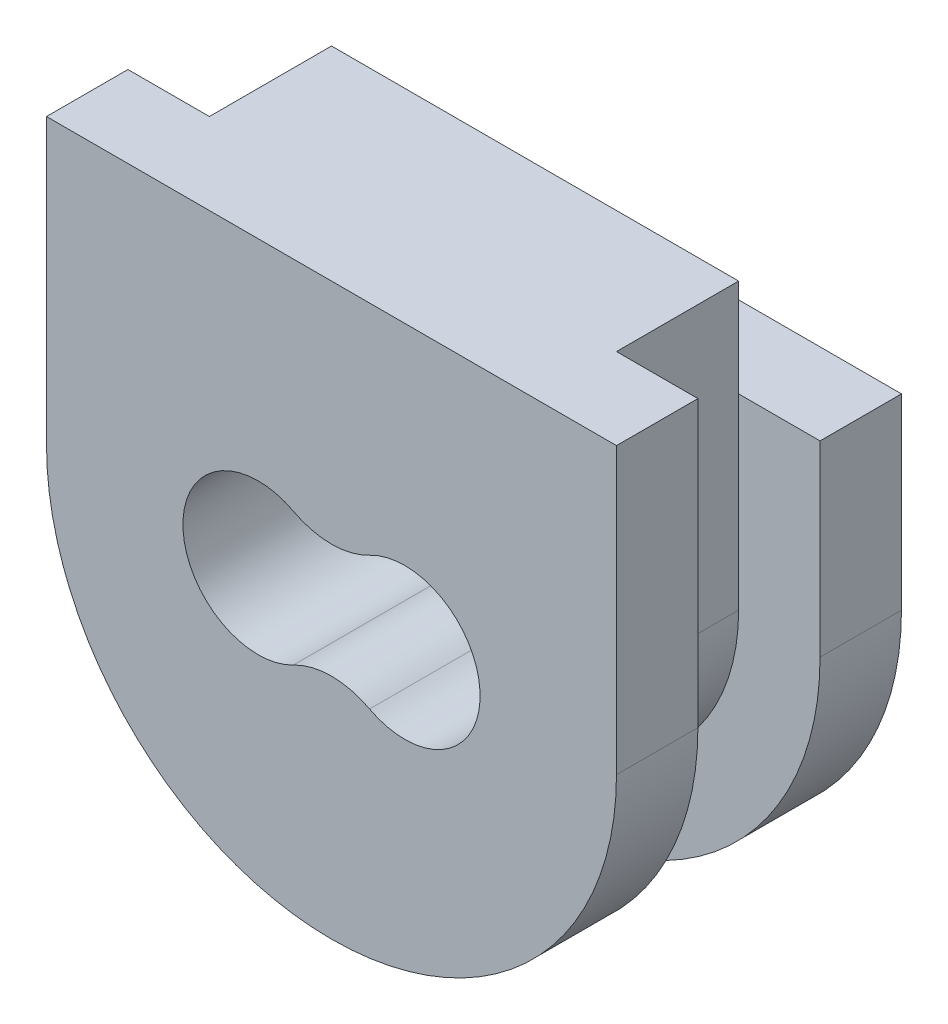
ISO-10303-21;
HEADER;
FILE_DESCRIPTION(('STEP AP214'),'2;1');
FILE_NAME('part.step','',(''),(''),'','','');
FILE_SCHEMA(('AUTOMOTIVE_DESIGN { 1 0 10303 214 1 1 1 1 }'));
ENDSEC;
DATA;
#1=APPLICATION_CONTEXT('core data for automotive mechanical design processes');
#2=APPLICATION_PROTOCOL_DEFINITION('international standard','automotive_design',2000,#1);
#3=PRODUCT_CONTEXT('',#1,'mechanical');
#4=PRODUCT('Part','Part','',(#3));
#5=PRODUCT_RELATED_PRODUCT_CATEGORY('part','',(#4));
#6=PRODUCT_DEFINITION_FORMATION('','',#4);
#7=PRODUCT_DEFINITION_CONTEXT('part definition',#1,'design');
#8=PRODUCT_DEFINITION('design','',#6,#7);
#9=PRODUCT_DEFINITION_SHAPE('','',#8);
#10=(LENGTH_UNIT() NAMED_UNIT(*) SI_UNIT(.MILLI.,.METRE.));
#11=(NAMED_UNIT(*) PLANE_ANGLE_UNIT() SI_UNIT($,.RADIAN.));
#12=(NAMED_UNIT(*) SI_UNIT($,.STERADIAN.) SOLID_ANGLE_UNIT());
#13=UNCERTAINTY_MEASURE_WITH_UNIT(LENGTH_MEASURE(1.E-05),#10,'distance_accuracy_value','');
#14=(GEOMETRIC_REPRESENTATION_CONTEXT(3) GLOBAL_UNCERTAINTY_ASSIGNED_CONTEXT((#13)) GLOBAL_UNIT_ASSIGNED_CONTEXT((#10,
#11,#12)) REPRESENTATION_CONTEXT('',''));
#15=CARTESIAN_POINT('',(0.,0.,0.));
#16=DIRECTION('',(0.,0.,1.));
#17=DIRECTION('',(1.,0.,0.));
#18=AXIS2_PLACEMENT_3D('',#15,#16,#17);
#19=CARTESIAN_POINT('',(0.,0.,3.));
#20=DIRECTION('',(0.,0.,-1.));
#21=DIRECTION('',(-1.,0.,0.));
#22=AXIS2_PLACEMENT_3D('',#19,#20,#21);
#23=CYLINDRICAL_SURFACE('',#22,5.);
#24=CARTESIAN_POINT('',(0.,0.,0.));
#25=DIRECTION('',(0.,0.,1.));
#26=DIRECTION('',(1.,0.,0.));
#27=AXIS2_PLACEMENT_3D('',#24,#25,#26);
#28=CIRCLE('',#27,5.);
#29=CARTESIAN_POINT('',(-5.,0.,0.));
#30=VERTEX_POINT('',#29);
#31=CARTESIAN_POINT('',(5.,0.,0.));
#32=VERTEX_POINT('',#31);
#33=EDGE_CURVE('E190',#30,#32,#28,.T.);
#34=ORIENTED_EDGE('',*,*,#33,.T.);
#35=DIRECTION('',(0.,0.,-1.));
#36=VECTOR('',#35,1.);
#37=CARTESIAN_POINT('',(5.,0.,3.));
#38=LINE('',#37,#36);
#39=CARTESIAN_POINT('',(5.,0.,3.));
#40=VERTEX_POINT('',#39);
#41=EDGE_CURVE('E11',#40,#32,#38,.T.);
#42=ORIENTED_EDGE('',*,*,#41,.F.);
#43=CARTESIAN_POINT('',(0.,0.,3.));
#44=DIRECTION('',(0.,0.,1.));
#45=DIRECTION('',(1.,0.,0.));
#46=AXIS2_PLACEMENT_3D('',#43,#44,#45);
#47=CIRCLE('',#46,5.);
#48=CARTESIAN_POINT('',(-5.,0.,3.));
#49=VERTEX_POINT('',#48);
#50=EDGE_CURVE('E193',#49,#40,#47,.T.);
#51=ORIENTED_EDGE('',*,*,#50,.F.);
#52=DIRECTION('',(0.,0.,-1.));
#53=VECTOR('',#52,1.);
#54=CARTESIAN_POINT('',(-5.,0.,3.));
#55=LINE('',#54,#53);
#56=EDGE_CURVE('E208',#49,#30,#55,.T.);
#57=ORIENTED_EDGE('',*,*,#56,.T.);
#58=EDGE_LOOP('',(#34,#42,#51,#57));
#59=FACE_BOUND('',#58,.T.);
#60=ADVANCED_FACE('F32',(#59),#23,.T.);
#61=CARTESIAN_POINT('',(5.,0.,3.));
#62=DIRECTION('',(-1.,0.,0.));
#63=DIRECTION('',(0.,0.,1.));
#64=AXIS2_PLACEMENT_3D('',#61,#62,#63);
#65=PLANE('',#64);
#66=DIRECTION('',(0.,1.,0.));
#67=VECTOR('',#66,1.);
#68=CARTESIAN_POINT('',(5.,0.,0.));
#69=LINE('',#68,#67);
#70=CARTESIAN_POINT('',(5.,4.59999999999997,0.));
#71=VERTEX_POINT('',#70);
#72=EDGE_CURVE('E221',#32,#71,#69,.T.);
#73=ORIENTED_EDGE('',*,*,#72,.T.);
#74=DIRECTION('',(0.,1.,0.));
#75=VECTOR('',#74,1.);
#76=CARTESIAN_POINT('',(5.,0.,0.));
#77=LINE('',#76,#75);
#78=CARTESIAN_POINT('',(5.,7.,0.));
#79=VERTEX_POINT('',#78);
#80=EDGE_CURVE('E314',#71,#79,#77,.T.);
#81=ORIENTED_EDGE('',*,*,#80,.T.);
#82=DIRECTION('',(0.,0.,-1.));
#83=VECTOR('',#82,1.);
#84=CARTESIAN_POINT('',(5.,7.,3.));
#85=LINE('',#84,#83);
#86=CARTESIAN_POINT('',(5.,7.,3.));
#87=VERTEX_POINT('',#86);
#88=EDGE_CURVE('E41',#87,#79,#85,.T.);
#89=ORIENTED_EDGE('',*,*,#88,.F.);
#90=DIRECTION('',(0.,1.,0.));
#91=VECTOR('',#90,1.);
#92=CARTESIAN_POINT('',(5.,0.,3.));
#93=LINE('',#92,#91);
#94=EDGE_CURVE('E196',#40,#87,#93,.T.);
#95=ORIENTED_EDGE('',*,*,#94,.F.);
#96=ORIENTED_EDGE('',*,*,#41,.T.);
#97=EDGE_LOOP('',(#73,#81,#89,#95,#96));
#98=FACE_BOUND('',#97,.T.);
#99=ADVANCED_FACE('F351',(#98),#65,.F.);
#100=CARTESIAN_POINT('',(-5.,7.,3.));
#101=DIRECTION('',(0.,-1.,0.));
#102=DIRECTION('',(0.,0.,-1.));
#103=AXIS2_PLACEMENT_3D('',#100,#101,#102);
#104=PLANE('',#103);
#105=ORIENTED_EDGE('',*,*,#88,.T.);
#106=DIRECTION('',(1.,0.,0.));
#107=VECTOR('',#106,1.);
#108=CARTESIAN_POINT('',(7.,7.,0.));
#109=LINE('',#108,#107);
#110=CARTESIAN_POINT('',(-5.,7.,0.));
#111=VERTEX_POINT('',#110);
#112=EDGE_CURVE('E161',#111,#79,#109,.T.);
#113=ORIENTED_EDGE('',*,*,#112,.F.);
#114=DIRECTION('',(0.,0.,-1.));
#115=VECTOR('',#114,1.);
#116=CARTESIAN_POINT('',(-5.,7.,3.));
#117=LINE('',#116,#115);
#118=CARTESIAN_POINT('',(-5.,7.,3.));
#119=VERTEX_POINT('',#118);
#120=EDGE_CURVE('E211',#119,#111,#117,.T.);
#121=ORIENTED_EDGE('',*,*,#120,.F.);
#122=DIRECTION('',(-1.,0.,0.));
#123=VECTOR('',#122,1.);
#124=CARTESIAN_POINT('',(7.,7.,3.));
#125=LINE('',#124,#123);
#126=CARTESIAN_POINT('',(-7.,7.,3.));
#127=VERTEX_POINT('',#126);
#128=EDGE_CURVE('E237',#119,#127,#125,.T.);
#129=ORIENTED_EDGE('',*,*,#128,.T.);
#130=DIRECTION('',(0.,0.,-1.));
#131=VECTOR('',#130,1.);
#132=CARTESIAN_POINT('',(-7.,7.,5.));
#133=LINE('',#132,#131);
#134=CARTESIAN_POINT('',(-7.,7.,5.));
#135=VERTEX_POINT('',#134);
#136=EDGE_CURVE('E258',#135,#127,#133,.T.);
#137=ORIENTED_EDGE('',*,*,#136,.F.);
#138=DIRECTION('',(-1.,0.,0.));
#139=VECTOR('',#138,1.);
#140=CARTESIAN_POINT('',(7.,7.,5.));
#141=LINE('',#140,#139);
#142=CARTESIAN_POINT('',(7.,7.,5.));
#143=VERTEX_POINT('',#142);
#144=EDGE_CURVE('E262',#143,#135,#141,.T.);
#145=ORIENTED_EDGE('',*,*,#144,.F.);
#146=DIRECTION('',(0.,0.,-1.));
#147=VECTOR('',#146,1.);
#148=CARTESIAN_POINT('',(7.,7.,5.));
#149=LINE('',#148,#147);
#150=CARTESIAN_POINT('',(7.,7.,3.));
#151=VERTEX_POINT('',#150);
#152=EDGE_CURVE('E261',#143,#151,#149,.T.);
#153=ORIENTED_EDGE('',*,*,#152,.T.);
#154=EDGE_CURVE('E243',#151,#87,#125,.T.);
#155=ORIENTED_EDGE('',*,*,#154,.T.);
#156=EDGE_LOOP('',(#105,#113,#121,#129,#137,#145,#153,#155));
#157=FACE_BOUND('',#156,.T.);
#158=ADVANCED_FACE('F355',(#157),#104,.F.);
#159=CARTESIAN_POINT('',(-5.,0.,3.));
#160=DIRECTION('',(1.,0.,0.));
#161=DIRECTION('',(0.,0.,-1.));
#162=AXIS2_PLACEMENT_3D('',#159,#160,#161);
#163=PLANE('',#162);
#164=DIRECTION('',(0.,-1.,0.));
#165=VECTOR('',#164,1.);
#166=CARTESIAN_POINT('',(-5.,0.,0.));
#167=LINE('',#166,#165);
#168=CARTESIAN_POINT('',(-5.,4.59999999999997,0.));
#169=VERTEX_POINT('',#168);
#170=EDGE_CURVE('E197',#111,#169,#167,.T.);
#171=ORIENTED_EDGE('',*,*,#170,.T.);
#172=EDGE_CURVE('E35',#169,#30,#167,.T.);
#173=ORIENTED_EDGE('',*,*,#172,.T.);
#174=ORIENTED_EDGE('',*,*,#56,.F.);
#175=DIRECTION('',(0.,-1.,0.));
#176=VECTOR('',#175,1.);
#177=CARTESIAN_POINT('',(-5.,0.,3.));
#178=LINE('',#177,#176);
#179=EDGE_CURVE('E203',#119,#49,#178,.T.);
#180=ORIENTED_EDGE('',*,*,#179,.F.);
#181=ORIENTED_EDGE('',*,*,#120,.T.);
#182=EDGE_LOOP('',(#171,#173,#174,#180,#181));
#183=FACE_BOUND('',#182,.T.);
#184=ADVANCED_FACE('F232',(#183),#163,.F.);
#185=CARTESIAN_POINT('',(0.,0.,0.));
#186=DIRECTION('',(0.,0.,1.));
#187=DIRECTION('',(1.,0.,0.));
#188=AXIS2_PLACEMENT_3D('',#185,#186,#187);
#189=PLANE('',#188);
#190=DIRECTION('',(-1.,0.,0.));
#191=VECTOR('',#190,1.);
#192=CARTESIAN_POINT('',(7.,4.59999999999997,0.));
#193=LINE('',#192,#191);
#194=CARTESIAN_POINT('',(-7.,4.59999999999997,0.));
#195=VERTEX_POINT('',#194);
#196=EDGE_CURVE('E155',#169,#195,#193,.T.);
#197=ORIENTED_EDGE('',*,*,#196,.T.);
#198=DIRECTION('',(0.,-1.,0.));
#199=VECTOR('',#198,1.);
#200=CARTESIAN_POINT('',(-7.,7.,0.));
#201=LINE('',#200,#199);
#202=CARTESIAN_POINT('',(-7.,0.,0.));
#203=VERTEX_POINT('',#202);
#204=EDGE_CURVE('E168',#195,#203,#201,.T.);
#205=ORIENTED_EDGE('',*,*,#204,.T.);
#206=CARTESIAN_POINT('',(0.,0.,0.));
#207=DIRECTION('',(0.,0.,1.));
#208=DIRECTION('',(1.,0.,0.));
#209=AXIS2_PLACEMENT_3D('',#206,#207,#208);
#210=CIRCLE('',#209,7.);
#211=CARTESIAN_POINT('',(7.,0.,0.));
#212=VERTEX_POINT('',#211);
#213=EDGE_CURVE('E178',#203,#212,#210,.T.);
#214=ORIENTED_EDGE('',*,*,#213,.T.);
#215=DIRECTION('',(0.,1.,0.));
#216=VECTOR('',#215,1.);
#217=CARTESIAN_POINT('',(7.,0.,0.));
#218=LINE('',#217,#216);
#219=CARTESIAN_POINT('',(7.,4.59999999999997,0.));
#220=VERTEX_POINT('',#219);
#221=EDGE_CURVE('E179',#212,#220,#218,.T.);
#222=ORIENTED_EDGE('',*,*,#221,.T.);
#223=EDGE_CURVE('E162',#220,#71,#193,.T.);
#224=ORIENTED_EDGE('',*,*,#223,.T.);
#225=ORIENTED_EDGE('',*,*,#72,.F.);
#226=ORIENTED_EDGE('',*,*,#33,.F.);
#227=ORIENTED_EDGE('',*,*,#172,.F.);
#228=EDGE_LOOP('',(#197,#205,#214,#222,#224,#225,#226,#227));
#229=FACE_BOUND('',#228,.T.);
#230=ADVANCED_FACE('F166',(#229),#189,.T.);
#231=CARTESIAN_POINT('',(7.,0.,-2.));
#232=DIRECTION('',(1.,0.,0.));
#233=DIRECTION('',(0.,1.,0.));
#234=AXIS2_PLACEMENT_3D('',#231,#232,#233);
#235=PLANE('',#234);
#236=DIRECTION('',(0.,0.,-1.));
#237=VECTOR('',#236,1.);
#238=CARTESIAN_POINT('',(7.,4.59999999999997,14.2042247236518));
#239=LINE('',#238,#237);
#240=CARTESIAN_POINT('',(7.,4.59999999999997,-2.));
#241=VERTEX_POINT('',#240);
#242=EDGE_CURVE('E49',#220,#241,#239,.T.);
#243=ORIENTED_EDGE('',*,*,#242,.F.);
#244=ORIENTED_EDGE('',*,*,#221,.F.);
#245=DIRECTION('',(0.,0.,1.));
#246=VECTOR('',#245,1.);
#247=CARTESIAN_POINT('',(7.,0.,-2.));
#248=LINE('',#247,#246);
#249=CARTESIAN_POINT('',(7.,0.,-2.));
#250=VERTEX_POINT('',#249);
#251=EDGE_CURVE('E188',#250,#212,#248,.T.);
#252=ORIENTED_EDGE('',*,*,#251,.F.);
#253=DIRECTION('',(0.,1.,0.));
#254=VECTOR('',#253,1.);
#255=CARTESIAN_POINT('',(7.,0.,-2.));
#256=LINE('',#255,#254);
#257=EDGE_CURVE('E181',#250,#241,#256,.T.);
#258=ORIENTED_EDGE('',*,*,#257,.T.);
#259=EDGE_LOOP('',(#243,#244,#252,#258));
#260=FACE_BOUND('',#259,.T.);
#261=ADVANCED_FACE('F330',(#260),#235,.T.);
#262=CARTESIAN_POINT('',(0.,0.,-2.));
#263=DIRECTION('',(0.,0.,1.));
#264=DIRECTION('',(1.,0.,0.));
#265=AXIS2_PLACEMENT_3D('',#262,#263,#264);
#266=CYLINDRICAL_SURFACE('',#265,7.);
#267=ORIENTED_EDGE('',*,*,#213,.F.);
#268=DIRECTION('',(0.,0.,1.));
#269=VECTOR('',#268,1.);
#270=CARTESIAN_POINT('',(-7.,0.,-2.));
#271=LINE('',#270,#269);
#272=CARTESIAN_POINT('',(-7.,0.,-2.));
#273=VERTEX_POINT('',#272);
#274=EDGE_CURVE('E176',#273,#203,#271,.T.);
#275=ORIENTED_EDGE('',*,*,#274,.F.);
#276=CARTESIAN_POINT('',(0.,0.,-2.));
#277=DIRECTION('',(0.,0.,1.));
#278=DIRECTION('',(1.,0.,0.));
#279=AXIS2_PLACEMENT_3D('',#276,#277,#278);
#280=CIRCLE('',#279,7.);
#281=EDGE_CURVE('E192',#273,#250,#280,.T.);
#282=ORIENTED_EDGE('',*,*,#281,.T.);
#283=ORIENTED_EDGE('',*,*,#251,.T.);
#284=EDGE_LOOP('',(#267,#275,#282,#283));
#285=FACE_BOUND('',#284,.T.);
#286=ADVANCED_FACE('F333',(#285),#266,.T.);
#287=CARTESIAN_POINT('',(-7.,7.,-2.));
#288=DIRECTION('',(-1.,0.,0.));
#289=DIRECTION('',(0.,-1.,0.));
#290=AXIS2_PLACEMENT_3D('',#287,#288,#289);
#291=PLANE('',#290);
#292=DIRECTION('',(0.,0.,-1.));
#293=VECTOR('',#292,1.);
#294=CARTESIAN_POINT('',(-7.,4.59999999999997,14.2042247236518));
#295=LINE('',#294,#293);
#296=CARTESIAN_POINT('',(-7.,4.59999999999997,-2.));
#297=VERTEX_POINT('',#296);
#298=EDGE_CURVE('E151',#195,#297,#295,.T.);
#299=ORIENTED_EDGE('',*,*,#298,.T.);
#300=DIRECTION('',(0.,-1.,0.));
#301=VECTOR('',#300,1.);
#302=CARTESIAN_POINT('',(-7.,7.,-2.));
#303=LINE('',#302,#301);
#304=EDGE_CURVE('E338',#297,#273,#303,.T.);
#305=ORIENTED_EDGE('',*,*,#304,.T.);
#306=ORIENTED_EDGE('',*,*,#274,.T.);
#307=ORIENTED_EDGE('',*,*,#204,.F.);
#308=EDGE_LOOP('',(#299,#305,#306,#307));
#309=FACE_BOUND('',#308,.T.);
#310=ADVANCED_FACE('F174',(#309),#291,.T.);
#311=CARTESIAN_POINT('',(0.,0.,-2.));
#312=DIRECTION('',(0.,0.,1.));
#313=DIRECTION('',(1.,0.,0.));
#314=AXIS2_PLACEMENT_3D('',#311,#312,#313);
#315=PLANE('',#314);
#316=CARTESIAN_POINT('',(-1.8,0.,-2.));
#317=DIRECTION('',(0.,0.,1.));
#318=DIRECTION('',(1.,0.,0.));
#319=AXIS2_PLACEMENT_3D('',#316,#317,#318);
#320=CIRCLE('',#319,1.85);
#321=CARTESIAN_POINT('',(-0.935064935064935,1.63535541502322,-2.));
#322=VERTEX_POINT('',#321);
#323=CARTESIAN_POINT('',(-0.935064935064936,-1.63535541502322,-2.));
#324=VERTEX_POINT('',#323);
#325=EDGE_CURVE('E291',#322,#324,#320,.T.);
#326=ORIENTED_EDGE('',*,*,#325,.T.);
#327=CARTESIAN_POINT('',(0.,-3.40330721504833,-2.));
#328=DIRECTION('',(0.,0.,-1.));
#329=DIRECTION('',(-1.,0.,0.));
#330=AXIS2_PLACEMENT_3D('',#327,#328,#329);
#331=CIRCLE('',#330,2.);
#332=CARTESIAN_POINT('',(0.935064935064935,-1.63535541502322,-2.));
#333=VERTEX_POINT('',#332);
#334=EDGE_CURVE('E300',#324,#333,#331,.T.);
#335=ORIENTED_EDGE('',*,*,#334,.T.);
#336=CARTESIAN_POINT('',(1.8,0.,-2.));
#337=DIRECTION('',(0.,0.,1.));
#338=DIRECTION('',(1.,0.,0.));
#339=AXIS2_PLACEMENT_3D('',#336,#337,#338);
#340=CIRCLE('',#339,1.85);
#341=CARTESIAN_POINT('',(0.935064935064934,1.63535541502322,-2.));
#342=VERTEX_POINT('',#341);
#343=EDGE_CURVE('E297',#333,#342,#340,.T.);
#344=ORIENTED_EDGE('',*,*,#343,.T.);
#345=CARTESIAN_POINT('',(0.,3.40330721504833,-2.));
#346=DIRECTION('',(0.,0.,-1.));
#347=DIRECTION('',(-1.,0.,0.));
#348=AXIS2_PLACEMENT_3D('',#345,#346,#347);
#349=CIRCLE('',#348,2.);
#350=EDGE_CURVE('E57',#342,#322,#349,.T.);
#351=ORIENTED_EDGE('',*,*,#350,.T.);
#352=EDGE_LOOP('',(#326,#335,#344,#351));
#353=FACE_BOUND('',#352,.T.);
#354=ORIENTED_EDGE('',*,*,#304,.F.);
#355=DIRECTION('',(-1.,0.,0.));
#356=VECTOR('',#355,1.);
#357=CARTESIAN_POINT('',(7.,4.59999999999997,-2.));
#358=LINE('',#357,#356);
#359=EDGE_CURVE('E157',#241,#297,#358,.T.);
#360=ORIENTED_EDGE('',*,*,#359,.F.);
#361=ORIENTED_EDGE('',*,*,#257,.F.);
#362=ORIENTED_EDGE('',*,*,#281,.F.);
#363=EDGE_LOOP('',(#354,#360,#361,#362));
#364=FACE_BOUND('',#363,.T.);
#365=ADVANCED_FACE('F337',(#353,#364),#315,.F.);
#366=CARTESIAN_POINT('',(0.,0.,3.));
#367=DIRECTION('',(0.,0.,1.));
#368=DIRECTION('',(1.,0.,0.));
#369=AXIS2_PLACEMENT_3D('',#366,#367,#368);
#370=PLANE('',#369);
#371=ORIENTED_EDGE('',*,*,#50,.T.);
#372=ORIENTED_EDGE('',*,*,#94,.T.);
#373=ORIENTED_EDGE('',*,*,#154,.F.);
#374=DIRECTION('',(0.,1.,0.));
#375=VECTOR('',#374,1.);
#376=CARTESIAN_POINT('',(7.,0.,3.));
#377=LINE('',#376,#375);
#378=CARTESIAN_POINT('',(7.,0.,3.));
#379=VERTEX_POINT('',#378);
#380=EDGE_CURVE('E244',#379,#151,#377,.T.);
#381=ORIENTED_EDGE('',*,*,#380,.F.);
#382=CARTESIAN_POINT('',(0.,0.,3.));
#383=DIRECTION('',(0.,0.,1.));
#384=DIRECTION('',(1.,0.,0.));
#385=AXIS2_PLACEMENT_3D('',#382,#383,#384);
#386=CIRCLE('',#385,7.);
#387=CARTESIAN_POINT('',(-7.,0.,3.));
#388=VERTEX_POINT('',#387);
#389=EDGE_CURVE('E249',#388,#379,#386,.T.);
#390=ORIENTED_EDGE('',*,*,#389,.F.);
#391=DIRECTION('',(0.,-1.,0.));
#392=VECTOR('',#391,1.);
#393=CARTESIAN_POINT('',(-7.,7.,3.));
#394=LINE('',#393,#392);
#395=EDGE_CURVE('E239',#127,#388,#394,.T.);
#396=ORIENTED_EDGE('',*,*,#395,.F.);
#397=ORIENTED_EDGE('',*,*,#128,.F.);
#398=ORIENTED_EDGE('',*,*,#179,.T.);
#399=EDGE_LOOP('',(#371,#372,#373,#381,#390,#396,#397,#398));
#400=FACE_BOUND('',#399,.T.);
#401=ADVANCED_FACE('F235',(#400),#370,.F.);
#402=CARTESIAN_POINT('',(-7.,7.,5.));
#403=DIRECTION('',(1.,0.,0.));
#404=DIRECTION('',(0.,1.,0.));
#405=AXIS2_PLACEMENT_3D('',#402,#403,#404);
#406=PLANE('',#405);
#407=ORIENTED_EDGE('',*,*,#395,.T.);
#408=DIRECTION('',(0.,0.,-1.));
#409=VECTOR('',#408,1.);
#410=CARTESIAN_POINT('',(-7.,0.,5.));
#411=LINE('',#410,#409);
#412=CARTESIAN_POINT('',(-7.,0.,5.));
#413=VERTEX_POINT('',#412);
#414=EDGE_CURVE('E184',#413,#388,#411,.T.);
#415=ORIENTED_EDGE('',*,*,#414,.F.);
#416=DIRECTION('',(0.,-1.,0.));
#417=VECTOR('',#416,1.);
#418=CARTESIAN_POINT('',(-7.,7.,5.));
#419=LINE('',#418,#417);
#420=EDGE_CURVE('E247',#135,#413,#419,.T.);
#421=ORIENTED_EDGE('',*,*,#420,.F.);
#422=ORIENTED_EDGE('',*,*,#136,.T.);
#423=EDGE_LOOP('',(#407,#415,#421,#422));
#424=FACE_BOUND('',#423,.T.);
#425=ADVANCED_FACE('F276',(#424),#406,.F.);
#426=CARTESIAN_POINT('',(0.,0.,5.));
#427=DIRECTION('',(0.,0.,-1.));
#428=DIRECTION('',(-1.,0.,0.));
#429=AXIS2_PLACEMENT_3D('',#426,#427,#428);
#430=CYLINDRICAL_SURFACE('',#429,7.);
#431=ORIENTED_EDGE('',*,*,#389,.T.);
#432=DIRECTION('',(0.,0.,-1.));
#433=VECTOR('',#432,1.);
#434=CARTESIAN_POINT('',(7.,0.,5.));
#435=LINE('',#434,#433);
#436=CARTESIAN_POINT('',(7.,0.,5.));
#437=VERTEX_POINT('',#436);
#438=EDGE_CURVE('E265',#437,#379,#435,.T.);
#439=ORIENTED_EDGE('',*,*,#438,.F.);
#440=CARTESIAN_POINT('',(0.,0.,5.));
#441=DIRECTION('',(0.,0.,1.));
#442=DIRECTION('',(1.,0.,0.));
#443=AXIS2_PLACEMENT_3D('',#440,#441,#442);
#444=CIRCLE('',#443,7.);
#445=EDGE_CURVE('E272',#413,#437,#444,.T.);
#446=ORIENTED_EDGE('',*,*,#445,.F.);
#447=ORIENTED_EDGE('',*,*,#414,.T.);
#448=EDGE_LOOP('',(#431,#439,#446,#447));
#449=FACE_BOUND('',#448,.T.);
#450=ADVANCED_FACE('F270',(#449),#430,.T.);
#451=CARTESIAN_POINT('',(7.,0.,5.));
#452=DIRECTION('',(-1.,0.,0.));
#453=DIRECTION('',(0.,-1.,0.));
#454=AXIS2_PLACEMENT_3D('',#451,#452,#453);
#455=PLANE('',#454);
#456=ORIENTED_EDGE('',*,*,#380,.T.);
#457=ORIENTED_EDGE('',*,*,#152,.F.);
#458=DIRECTION('',(0.,1.,0.));
#459=VECTOR('',#458,1.);
#460=CARTESIAN_POINT('',(7.,0.,5.));
#461=LINE('',#460,#459);
#462=EDGE_CURVE('E283',#437,#143,#461,.T.);
#463=ORIENTED_EDGE('',*,*,#462,.F.);
#464=ORIENTED_EDGE('',*,*,#438,.T.);
#465=EDGE_LOOP('',(#456,#457,#463,#464));
#466=FACE_BOUND('',#465,.T.);
#467=ADVANCED_FACE('F428',(#466),#455,.F.);
#468=CARTESIAN_POINT('',(0.,0.,5.));
#469=DIRECTION('',(0.,0.,1.));
#470=DIRECTION('',(1.,0.,0.));
#471=AXIS2_PLACEMENT_3D('',#468,#469,#470);
#472=PLANE('',#471);
#473=CARTESIAN_POINT('',(0.,-3.40330721504833,5.));
#474=DIRECTION('',(0.,0.,-1.));
#475=DIRECTION('',(-1.,0.,0.));
#476=AXIS2_PLACEMENT_3D('',#473,#474,#475);
#477=CIRCLE('',#476,2.);
#478=CARTESIAN_POINT('',(-0.935064935064936,-1.63535541502322,5.));
#479=VERTEX_POINT('',#478);
#480=CARTESIAN_POINT('',(0.935064935064935,-1.63535541502322,5.));
#481=VERTEX_POINT('',#480);
#482=EDGE_CURVE('E312',#479,#481,#477,.T.);
#483=ORIENTED_EDGE('',*,*,#482,.F.);
#484=CARTESIAN_POINT('',(-1.8,0.,5.));
#485=DIRECTION('',(0.,0.,1.));
#486=DIRECTION('',(1.,0.,0.));
#487=AXIS2_PLACEMENT_3D('',#484,#485,#486);
#488=CIRCLE('',#487,1.85);
#489=CARTESIAN_POINT('',(-0.935064935064935,1.63535541502322,5.));
#490=VERTEX_POINT('',#489);
#491=EDGE_CURVE('E303',#490,#479,#488,.T.);
#492=ORIENTED_EDGE('',*,*,#491,.F.);
#493=CARTESIAN_POINT('',(0.,3.40330721504833,5.));
#494=DIRECTION('',(0.,0.,-1.));
#495=DIRECTION('',(-1.,0.,0.));
#496=AXIS2_PLACEMENT_3D('',#493,#494,#495);
#497=CIRCLE('',#496,2.);
#498=CARTESIAN_POINT('',(0.935064935064934,1.63535541502322,5.));
#499=VERTEX_POINT('',#498);
#500=EDGE_CURVE('E306',#499,#490,#497,.T.);
#501=ORIENTED_EDGE('',*,*,#500,.F.);
#502=CARTESIAN_POINT('',(1.8,0.,5.));
#503=DIRECTION('',(0.,0.,1.));
#504=DIRECTION('',(1.,0.,0.));
#505=AXIS2_PLACEMENT_3D('',#502,#503,#504);
#506=CIRCLE('',#505,1.85);
#507=EDGE_CURVE('E309',#481,#499,#506,.T.);
#508=ORIENTED_EDGE('',*,*,#507,.F.);
#509=EDGE_LOOP('',(#483,#492,#501,#508));
#510=FACE_BOUND('',#509,.T.);
#511=ORIENTED_EDGE('',*,*,#420,.T.);
#512=ORIENTED_EDGE('',*,*,#445,.T.);
#513=ORIENTED_EDGE('',*,*,#462,.T.);
#514=ORIENTED_EDGE('',*,*,#144,.T.);
#515=EDGE_LOOP('',(#511,#512,#513,#514));
#516=FACE_BOUND('',#515,.T.);
#517=ADVANCED_FACE('F425',(#510,#516),#472,.T.);
#518=CARTESIAN_POINT('',(0.,-3.40330721504833,-2.));
#519=DIRECTION('',(0.,0.,1.));
#520=DIRECTION('',(1.,0.,0.));
#521=AXIS2_PLACEMENT_3D('',#518,#519,#520);
#522=CYLINDRICAL_SURFACE('',#521,2.);
#523=DIRECTION('',(0.,0.,1.));
#524=VECTOR('',#523,1.);
#525=CARTESIAN_POINT('',(0.935064935064935,-1.63535541502322,-2.));
#526=LINE('',#525,#524);
#527=EDGE_CURVE('E287',#333,#481,#526,.T.);
#528=ORIENTED_EDGE('',*,*,#527,.F.);
#529=ORIENTED_EDGE('',*,*,#334,.F.);
#530=DIRECTION('',(0.,0.,1.));
#531=VECTOR('',#530,1.);
#532=CARTESIAN_POINT('',(-0.935064935064936,-1.63535541502322,-2.));
#533=LINE('',#532,#531);
#534=EDGE_CURVE('E277',#324,#479,#533,.T.);
#535=ORIENTED_EDGE('',*,*,#534,.T.);
#536=ORIENTED_EDGE('',*,*,#482,.T.);
#537=EDGE_LOOP('',(#528,#529,#535,#536));
#538=FACE_BOUND('',#537,.T.);
#539=ADVANCED_FACE('F417',(#538),#522,.T.);
#540=CARTESIAN_POINT('',(-1.8,0.,-2.));
#541=DIRECTION('',(0.,0.,1.));
#542=DIRECTION('',(1.,0.,0.));
#543=AXIS2_PLACEMENT_3D('',#540,#541,#542);
#544=CYLINDRICAL_SURFACE('',#543,1.85);
#545=ORIENTED_EDGE('',*,*,#534,.F.);
#546=ORIENTED_EDGE('',*,*,#325,.F.);
#547=DIRECTION('',(0.,0.,1.));
#548=VECTOR('',#547,1.);
#549=CARTESIAN_POINT('',(-0.935064935064935,1.63535541502322,-2.));
#550=LINE('',#549,#548);
#551=EDGE_CURVE('E279',#322,#490,#550,.T.);
#552=ORIENTED_EDGE('',*,*,#551,.T.);
#553=ORIENTED_EDGE('',*,*,#491,.T.);
#554=EDGE_LOOP('',(#545,#546,#552,#553));
#555=FACE_BOUND('',#554,.T.);
#556=ADVANCED_FACE('F413',(#555),#544,.F.);
#557=CARTESIAN_POINT('',(0.,3.40330721504833,-2.));
#558=DIRECTION('',(0.,0.,1.));
#559=DIRECTION('',(1.,0.,0.));
#560=AXIS2_PLACEMENT_3D('',#557,#558,#559);
#561=CYLINDRICAL_SURFACE('',#560,2.);
#562=ORIENTED_EDGE('',*,*,#551,.F.);
#563=ORIENTED_EDGE('',*,*,#350,.F.);
#564=DIRECTION('',(0.,0.,1.));
#565=VECTOR('',#564,1.);
#566=CARTESIAN_POINT('',(0.935064935064934,1.63535541502322,-2.));
#567=LINE('',#566,#565);
#568=EDGE_CURVE('E290',#342,#499,#567,.T.);
#569=ORIENTED_EDGE('',*,*,#568,.T.);
#570=ORIENTED_EDGE('',*,*,#500,.T.);
#571=EDGE_LOOP('',(#562,#563,#569,#570));
#572=FACE_BOUND('',#571,.T.);
#573=ADVANCED_FACE('F416',(#572),#561,.T.);
#574=CARTESIAN_POINT('',(1.8,0.,-2.));
#575=DIRECTION('',(0.,0.,1.));
#576=DIRECTION('',(1.,0.,0.));
#577=AXIS2_PLACEMENT_3D('',#574,#575,#576);
#578=CYLINDRICAL_SURFACE('',#577,1.85);
#579=ORIENTED_EDGE('',*,*,#568,.F.);
#580=ORIENTED_EDGE('',*,*,#343,.F.);
#581=ORIENTED_EDGE('',*,*,#527,.T.);
#582=ORIENTED_EDGE('',*,*,#507,.T.);
#583=EDGE_LOOP('',(#579,#580,#581,#582));
#584=FACE_BOUND('',#583,.T.);
#585=ADVANCED_FACE('F398',(#584),#578,.F.);
#586=CARTESIAN_POINT('',(0.,0.,0.));
#587=DIRECTION('',(0.,0.,1.));
#588=DIRECTION('',(1.,0.,0.));
#589=AXIS2_PLACEMENT_3D('',#586,#587,#588);
#590=PLANE('',#589);
#591=EDGE_CURVE('E172',#71,#169,#193,.T.);
#592=ORIENTED_EDGE('',*,*,#591,.T.);
#593=ORIENTED_EDGE('',*,*,#170,.F.);
#594=ORIENTED_EDGE('',*,*,#112,.T.);
#595=ORIENTED_EDGE('',*,*,#80,.F.);
#596=EDGE_LOOP('',(#592,#593,#594,#595));
#597=FACE_BOUND('',#596,.T.);
#598=ADVANCED_FACE('F325',(#597),#590,.F.);
#599=CARTESIAN_POINT('',(7.,4.59999999999997,14.2042247236518));
#600=DIRECTION('',(0.,-1.,0.));
#601=DIRECTION('',(0.,0.,-1.));
#602=AXIS2_PLACEMENT_3D('',#599,#600,#601);
#603=PLANE('',#602);
#604=ORIENTED_EDGE('',*,*,#242,.T.);
#605=ORIENTED_EDGE('',*,*,#359,.T.);
#606=ORIENTED_EDGE('',*,*,#298,.F.);
#607=ORIENTED_EDGE('',*,*,#196,.F.);
#608=ORIENTED_EDGE('',*,*,#591,.F.);
#609=ORIENTED_EDGE('',*,*,#223,.F.);
#610=EDGE_LOOP('',(#604,#605,#606,#607,#608,#609));
#611=FACE_BOUND('',#610,.T.);
#612=ADVANCED_FACE('F153',(#611),#603,.F.);
#613=CLOSED_SHELL('',(#60,#99,#158,#184,#230,#261,#286,#310,#365,#401,#425,#450,#467,#517,#539,
#556,#573,#585,#598,#612));
#614=MANIFOLD_SOLID_BREP('B2',#613);
#615=ADVANCED_BREP_SHAPE_REPRESENTATION('',(#18,#614),#14);
#616=SHAPE_DEFINITION_REPRESENTATION(#9,#615);
ENDSEC;
END-ISO-10303-21;
